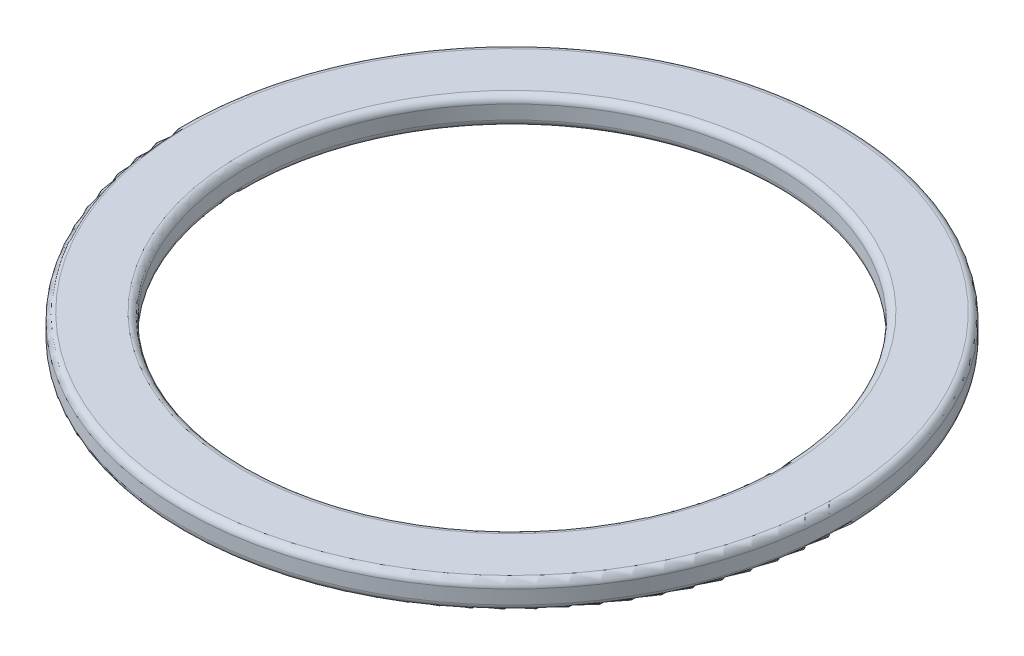
ISO-10303-21;
HEADER;
FILE_DESCRIPTION(('STEP AP214'),'2;1');
FILE_NAME('part.step','',(''),(''),'','','');
FILE_SCHEMA(('AUTOMOTIVE_DESIGN { 1 0 10303 214 1 1 1 1 }'));
ENDSEC;
DATA;
#1=APPLICATION_CONTEXT('core data for automotive mechanical design processes');
#2=APPLICATION_PROTOCOL_DEFINITION('international standard','automotive_design',2000,#1);
#3=PRODUCT_CONTEXT('',#1,'mechanical');
#4=PRODUCT('Part','Part','',(#3));
#5=PRODUCT_RELATED_PRODUCT_CATEGORY('part','',(#4));
#6=PRODUCT_DEFINITION_FORMATION('','',#4);
#7=PRODUCT_DEFINITION_CONTEXT('part definition',#1,'design');
#8=PRODUCT_DEFINITION('design','',#6,#7);
#9=PRODUCT_DEFINITION_SHAPE('','',#8);
#10=(LENGTH_UNIT() NAMED_UNIT(*) SI_UNIT(.MILLI.,.METRE.));
#11=(NAMED_UNIT(*) PLANE_ANGLE_UNIT() SI_UNIT($,.RADIAN.));
#12=(NAMED_UNIT(*) SI_UNIT($,.STERADIAN.) SOLID_ANGLE_UNIT());
#13=UNCERTAINTY_MEASURE_WITH_UNIT(LENGTH_MEASURE(1.E-05),#10,'distance_accuracy_value','');
#14=(GEOMETRIC_REPRESENTATION_CONTEXT(3) GLOBAL_UNCERTAINTY_ASSIGNED_CONTEXT((#13)) GLOBAL_UNIT_ASSIGNED_CONTEXT((#10,
#11,#12)) REPRESENTATION_CONTEXT('',''));
#15=CARTESIAN_POINT('',(0.,0.,0.));
#16=DIRECTION('',(0.,0.,1.));
#17=DIRECTION('',(1.,0.,0.));
#18=AXIS2_PLACEMENT_3D('',#15,#16,#17);
#19=CARTESIAN_POINT('',(0.,2.,0.));
#20=DIRECTION('',(0.,1.,0.));
#21=DIRECTION('',(0.,0.,1.));
#22=AXIS2_PLACEMENT_3D('',#19,#20,#21);
#23=PLANE('',#22);
#24=CARTESIAN_POINT('',(0.,2.,0.));
#25=DIRECTION('',(0.,1.,0.));
#26=DIRECTION('',(0.,0.,1.));
#27=AXIS2_PLACEMENT_3D('',#24,#25,#26);
#28=CIRCLE('',#27,19.65);
#29=CARTESIAN_POINT('',(0.,2.,19.65));
#30=VERTEX_POINT('',#29);
#31=EDGE_CURVE('E10',#30,#30,#28,.F.);
#32=ORIENTED_EDGE('',*,*,#31,.T.);
#33=EDGE_LOOP('',(#32));
#34=FACE_BOUND('',#33,.T.);
#35=CARTESIAN_POINT('',(0.,2.,0.));
#36=DIRECTION('',(0.,1.,0.));
#37=DIRECTION('',(0.,0.,1.));
#38=AXIS2_PLACEMENT_3D('',#35,#36,#37);
#39=CIRCLE('',#38,23.35);
#40=CARTESIAN_POINT('',(0.,2.,23.35));
#41=VERTEX_POINT('',#40);
#42=EDGE_CURVE('E38',#41,#41,#39,.T.);
#43=ORIENTED_EDGE('',*,*,#42,.T.);
#44=EDGE_LOOP('',(#43));
#45=FACE_BOUND('',#44,.T.);
#46=ADVANCED_FACE('F31',(#34,#45),#23,.T.);
#47=CARTESIAN_POINT('',(0.,0.,0.));
#48=DIRECTION('',(0.,1.,0.));
#49=DIRECTION('',(0.,0.,1.));
#50=AXIS2_PLACEMENT_3D('',#47,#48,#49);
#51=PLANE('',#50);
#52=CARTESIAN_POINT('',(0.,0.,0.));
#53=DIRECTION('',(0.,1.,0.));
#54=DIRECTION('',(0.,0.,1.));
#55=AXIS2_PLACEMENT_3D('',#52,#53,#54);
#56=CIRCLE('',#55,19.65);
#57=CARTESIAN_POINT('',(0.,0.,19.65));
#58=VERTEX_POINT('',#57);
#59=EDGE_CURVE('E57',#58,#58,#56,.T.);
#60=ORIENTED_EDGE('',*,*,#59,.T.);
#61=EDGE_LOOP('',(#60));
#62=FACE_BOUND('',#61,.T.);
#63=CARTESIAN_POINT('',(0.,0.,0.));
#64=DIRECTION('',(0.,1.,0.));
#65=DIRECTION('',(0.,0.,1.));
#66=AXIS2_PLACEMENT_3D('',#63,#64,#65);
#67=CIRCLE('',#66,23.35);
#68=CARTESIAN_POINT('',(0.,0.,23.35));
#69=VERTEX_POINT('',#68);
#70=EDGE_CURVE('E60',#69,#69,#67,.F.);
#71=ORIENTED_EDGE('',*,*,#70,.T.);
#72=EDGE_LOOP('',(#71));
#73=FACE_BOUND('',#72,.T.);
#74=ADVANCED_FACE('F64',(#62,#73),#51,.F.);
#75=CARTESIAN_POINT('',(0.,2.,0.));
#76=DIRECTION('',(0.,-1.,0.));
#77=DIRECTION('',(0.,0.,-1.));
#78=AXIS2_PLACEMENT_3D('',#75,#76,#77);
#79=CYLINDRICAL_SURFACE('',#78,23.85);
#80=CARTESIAN_POINT('',(0.,0.5,0.));
#81=DIRECTION('',(0.,1.,0.));
#82=DIRECTION('',(0.,0.,1.));
#83=AXIS2_PLACEMENT_3D('',#80,#81,#82);
#84=CIRCLE('',#83,23.85);
#85=CARTESIAN_POINT('',(0.,0.5,23.85));
#86=VERTEX_POINT('',#85);
#87=EDGE_CURVE('E42',#86,#86,#84,.T.);
#88=ORIENTED_EDGE('',*,*,#87,.T.);
#89=EDGE_LOOP('',(#88));
#90=FACE_BOUND('',#89,.T.);
#91=CARTESIAN_POINT('',(0.,1.5,0.));
#92=DIRECTION('',(0.,1.,0.));
#93=DIRECTION('',(0.,0.,1.));
#94=AXIS2_PLACEMENT_3D('',#91,#92,#93);
#95=CIRCLE('',#94,23.85);
#96=CARTESIAN_POINT('',(0.,1.5,23.85));
#97=VERTEX_POINT('',#96);
#98=EDGE_CURVE('E46',#97,#97,#95,.F.);
#99=ORIENTED_EDGE('',*,*,#98,.T.);
#100=EDGE_LOOP('',(#99));
#101=FACE_BOUND('',#100,.T.);
#102=ADVANCED_FACE('F74',(#90,#101),#79,.T.);
#103=CARTESIAN_POINT('',(0.,2.,0.));
#104=DIRECTION('',(0.,-1.,0.));
#105=DIRECTION('',(0.,0.,-1.));
#106=AXIS2_PLACEMENT_3D('',#103,#104,#105);
#107=CYLINDRICAL_SURFACE('',#106,19.15);
#108=CARTESIAN_POINT('',(0.,0.5,0.));
#109=DIRECTION('',(0.,1.,0.));
#110=DIRECTION('',(0.,0.,1.));
#111=AXIS2_PLACEMENT_3D('',#108,#109,#110);
#112=CIRCLE('',#111,19.15);
#113=CARTESIAN_POINT('',(0.,0.5,19.15));
#114=VERTEX_POINT('',#113);
#115=EDGE_CURVE('E51',#114,#114,#112,.F.);
#116=ORIENTED_EDGE('',*,*,#115,.T.);
#117=EDGE_LOOP('',(#116));
#118=FACE_BOUND('',#117,.T.);
#119=CARTESIAN_POINT('',(0.,1.5,0.));
#120=DIRECTION('',(0.,1.,0.));
#121=DIRECTION('',(0.,0.,1.));
#122=AXIS2_PLACEMENT_3D('',#119,#120,#121);
#123=CIRCLE('',#122,19.15);
#124=CARTESIAN_POINT('',(0.,1.5,19.15));
#125=VERTEX_POINT('',#124);
#126=EDGE_CURVE('E54',#125,#125,#123,.T.);
#127=ORIENTED_EDGE('',*,*,#126,.T.);
#128=EDGE_LOOP('',(#127));
#129=FACE_BOUND('',#128,.T.);
#130=ADVANCED_FACE('F77',(#118,#129),#107,.F.);
#131=CARTESIAN_POINT('',(0.,0.5,0.));
#132=DIRECTION('',(0.,1.,0.));
#133=DIRECTION('',(0.,0.,1.));
#134=AXIS2_PLACEMENT_3D('',#131,#132,#133);
#135=TOROIDAL_SURFACE('',#134,19.65,0.5);
#136=ORIENTED_EDGE('',*,*,#115,.F.);
#137=EDGE_LOOP('',(#136));
#138=FACE_BOUND('',#137,.T.);
#139=ORIENTED_EDGE('',*,*,#59,.F.);
#140=EDGE_LOOP('',(#139));
#141=FACE_BOUND('',#140,.T.);
#142=ADVANCED_FACE('F70',(#138,#141),#135,.T.);
#143=CARTESIAN_POINT('',(0.,0.5,0.));
#144=DIRECTION('',(0.,1.,0.));
#145=DIRECTION('',(0.,0.,1.));
#146=AXIS2_PLACEMENT_3D('',#143,#144,#145);
#147=TOROIDAL_SURFACE('',#146,23.35,0.5);
#148=ORIENTED_EDGE('',*,*,#70,.F.);
#149=EDGE_LOOP('',(#148));
#150=FACE_BOUND('',#149,.T.);
#151=ORIENTED_EDGE('',*,*,#87,.F.);
#152=EDGE_LOOP('',(#151));
#153=FACE_BOUND('',#152,.T.);
#154=ADVANCED_FACE('F66',(#150,#153),#147,.T.);
#155=CARTESIAN_POINT('',(0.,1.5,0.));
#156=DIRECTION('',(0.,1.,0.));
#157=DIRECTION('',(0.,0.,1.));
#158=AXIS2_PLACEMENT_3D('',#155,#156,#157);
#159=TOROIDAL_SURFACE('',#158,19.65,0.5);
#160=ORIENTED_EDGE('',*,*,#31,.F.);
#161=EDGE_LOOP('',(#160));
#162=FACE_BOUND('',#161,.T.);
#163=ORIENTED_EDGE('',*,*,#126,.F.);
#164=EDGE_LOOP('',(#163));
#165=FACE_BOUND('',#164,.T.);
#166=ADVANCED_FACE('F69',(#162,#165),#159,.T.);
#167=CARTESIAN_POINT('',(0.,1.5,0.));
#168=DIRECTION('',(0.,1.,0.));
#169=DIRECTION('',(0.,0.,1.));
#170=AXIS2_PLACEMENT_3D('',#167,#168,#169);
#171=TOROIDAL_SURFACE('',#170,23.35,0.5);
#172=ORIENTED_EDGE('',*,*,#98,.F.);
#173=EDGE_LOOP('',(#172));
#174=FACE_BOUND('',#173,.T.);
#175=ORIENTED_EDGE('',*,*,#42,.F.);
#176=EDGE_LOOP('',(#175));
#177=FACE_BOUND('',#176,.T.);
#178=ADVANCED_FACE('F33',(#174,#177),#171,.T.);
#179=CLOSED_SHELL('',(#46,#74,#102,#130,#142,#154,#166,#178));
#180=MANIFOLD_SOLID_BREP('B2',#179);
#181=ADVANCED_BREP_SHAPE_REPRESENTATION('',(#18,#180),#14);
#182=SHAPE_DEFINITION_REPRESENTATION(#9,#181);
ENDSEC;
END-ISO-10303-21;
